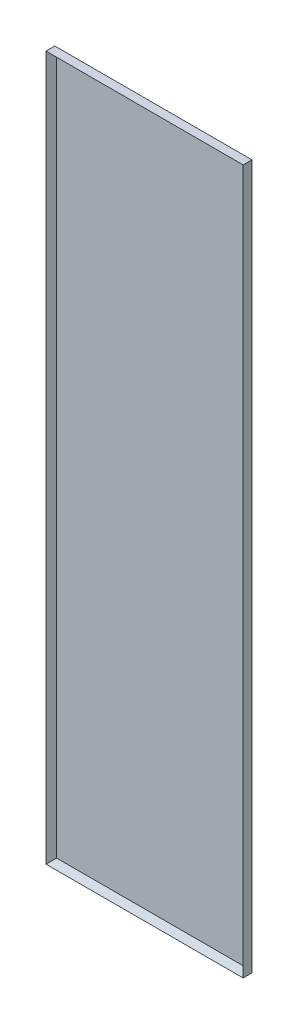
ISO-10303-21;
HEADER;
FILE_DESCRIPTION(('STEP AP214'),'2;1');
FILE_NAME('part.step','',(''),(''),'','','');
FILE_SCHEMA(('AUTOMOTIVE_DESIGN { 1 0 10303 214 1 1 1 1 }'));
ENDSEC;
DATA;
#1=APPLICATION_CONTEXT('core data for automotive mechanical design processes');
#2=APPLICATION_PROTOCOL_DEFINITION('international standard','automotive_design',2000,#1);
#3=PRODUCT_CONTEXT('',#1,'mechanical');
#4=PRODUCT('Part','Part','',(#3));
#5=PRODUCT_RELATED_PRODUCT_CATEGORY('part','',(#4));
#6=PRODUCT_DEFINITION_FORMATION('','',#4);
#7=PRODUCT_DEFINITION_CONTEXT('part definition',#1,'design');
#8=PRODUCT_DEFINITION('design','',#6,#7);
#9=PRODUCT_DEFINITION_SHAPE('','',#8);
#10=(LENGTH_UNIT() NAMED_UNIT(*) SI_UNIT(.MILLI.,.METRE.));
#11=(NAMED_UNIT(*) PLANE_ANGLE_UNIT() SI_UNIT($,.RADIAN.));
#12=(NAMED_UNIT(*) SI_UNIT($,.STERADIAN.) SOLID_ANGLE_UNIT());
#13=UNCERTAINTY_MEASURE_WITH_UNIT(LENGTH_MEASURE(1.E-05),#10,'distance_accuracy_value','');
#14=(GEOMETRIC_REPRESENTATION_CONTEXT(3) GLOBAL_UNCERTAINTY_ASSIGNED_CONTEXT((#13)) GLOBAL_UNIT_ASSIGNED_CONTEXT((#10,
#11,#12)) REPRESENTATION_CONTEXT('',''));
#15=CARTESIAN_POINT('',(0.,0.,0.));
#16=DIRECTION('',(0.,0.,1.));
#17=DIRECTION('',(1.,0.,0.));
#18=AXIS2_PLACEMENT_3D('',#15,#16,#17);
#19=CARTESIAN_POINT('',(0.,0.,25.));
#20=DIRECTION('',(1.,0.,0.));
#21=DIRECTION('',(0.,0.,-1.));
#22=AXIS2_PLACEMENT_3D('',#19,#20,#21);
#23=PLANE('',#22);
#24=DIRECTION('',(0.,-1.,0.));
#25=VECTOR('',#24,1.);
#26=CARTESIAN_POINT('',(0.,0.,0.));
#27=LINE('',#26,#25);
#28=CARTESIAN_POINT('',(0.,2000.,0.));
#29=VERTEX_POINT('',#28);
#30=CARTESIAN_POINT('',(0.,0.,0.));
#31=VERTEX_POINT('',#30);
#32=EDGE_CURVE('E98',#29,#31,#27,.T.);
#33=ORIENTED_EDGE('',*,*,#32,.T.);
#34=DIRECTION('',(0.,0.,-1.));
#35=VECTOR('',#34,1.);
#36=CARTESIAN_POINT('',(0.,0.,25.));
#37=LINE('',#36,#35);
#38=CARTESIAN_POINT('',(0.,0.,25.));
#39=VERTEX_POINT('',#38);
#40=EDGE_CURVE('E11',#39,#31,#37,.T.);
#41=ORIENTED_EDGE('',*,*,#40,.F.);
#42=DIRECTION('',(0.,-1.,0.));
#43=VECTOR('',#42,1.);
#44=CARTESIAN_POINT('',(0.,0.,25.));
#45=LINE('',#44,#43);
#46=CARTESIAN_POINT('',(0.,2000.,25.));
#47=VERTEX_POINT('',#46);
#48=EDGE_CURVE('E99',#47,#39,#45,.T.);
#49=ORIENTED_EDGE('',*,*,#48,.F.);
#50=DIRECTION('',(0.,0.,-1.));
#51=VECTOR('',#50,1.);
#52=CARTESIAN_POINT('',(0.,2000.,25.));
#53=LINE('',#52,#51);
#54=EDGE_CURVE('E93',#47,#29,#53,.T.);
#55=ORIENTED_EDGE('',*,*,#54,.T.);
#56=EDGE_LOOP('',(#33,#41,#49,#55));
#57=FACE_BOUND('',#56,.T.);
#58=ADVANCED_FACE('F43',(#57),#23,.F.);
#59=CARTESIAN_POINT('',(0.,0.,25.));
#60=DIRECTION('',(0.,1.,0.));
#61=DIRECTION('',(0.,0.,1.));
#62=AXIS2_PLACEMENT_3D('',#59,#60,#61);
#63=PLANE('',#62);
#64=DIRECTION('',(1.,0.,0.));
#65=VECTOR('',#64,1.);
#66=CARTESIAN_POINT('',(0.,0.,0.));
#67=LINE('',#66,#65);
#68=CARTESIAN_POINT('',(560.,0.,0.));
#69=VERTEX_POINT('',#68);
#70=EDGE_CURVE('E87',#31,#69,#67,.T.);
#71=ORIENTED_EDGE('',*,*,#70,.T.);
#72=DIRECTION('',(0.,0.,-1.));
#73=VECTOR('',#72,1.);
#74=CARTESIAN_POINT('',(560.,0.,25.));
#75=LINE('',#74,#73);
#76=CARTESIAN_POINT('',(560.,0.,25.));
#77=VERTEX_POINT('',#76);
#78=EDGE_CURVE('E51',#77,#69,#75,.T.);
#79=ORIENTED_EDGE('',*,*,#78,.F.);
#80=DIRECTION('',(1.,0.,0.));
#81=VECTOR('',#80,1.);
#82=CARTESIAN_POINT('',(0.,0.,25.));
#83=LINE('',#82,#81);
#84=EDGE_CURVE('E102',#39,#77,#83,.T.);
#85=ORIENTED_EDGE('',*,*,#84,.F.);
#86=ORIENTED_EDGE('',*,*,#40,.T.);
#87=EDGE_LOOP('',(#71,#79,#85,#86));
#88=FACE_BOUND('',#87,.T.);
#89=ADVANCED_FACE('F116',(#88),#63,.F.);
#90=CARTESIAN_POINT('',(560.,0.,25.));
#91=DIRECTION('',(-1.,0.,0.));
#92=DIRECTION('',(0.,0.,1.));
#93=AXIS2_PLACEMENT_3D('',#90,#91,#92);
#94=PLANE('',#93);
#95=DIRECTION('',(0.,1.,0.));
#96=VECTOR('',#95,1.);
#97=CARTESIAN_POINT('',(560.,0.,0.));
#98=LINE('',#97,#96);
#99=CARTESIAN_POINT('',(560.,2000.,0.));
#100=VERTEX_POINT('',#99);
#101=EDGE_CURVE('E77',#69,#100,#98,.T.);
#102=ORIENTED_EDGE('',*,*,#101,.T.);
#103=DIRECTION('',(0.,0.,-1.));
#104=VECTOR('',#103,1.);
#105=CARTESIAN_POINT('',(560.,2000.,25.));
#106=LINE('',#105,#104);
#107=CARTESIAN_POINT('',(560.,2000.,25.));
#108=VERTEX_POINT('',#107);
#109=EDGE_CURVE('E82',#108,#100,#106,.T.);
#110=ORIENTED_EDGE('',*,*,#109,.F.);
#111=DIRECTION('',(0.,1.,0.));
#112=VECTOR('',#111,1.);
#113=CARTESIAN_POINT('',(560.,0.,25.));
#114=LINE('',#113,#112);
#115=EDGE_CURVE('E108',#77,#108,#114,.T.);
#116=ORIENTED_EDGE('',*,*,#115,.F.);
#117=ORIENTED_EDGE('',*,*,#78,.T.);
#118=EDGE_LOOP('',(#102,#110,#116,#117));
#119=FACE_BOUND('',#118,.T.);
#120=ADVANCED_FACE('F79',(#119),#94,.F.);
#121=CARTESIAN_POINT('',(0.,2000.,25.));
#122=DIRECTION('',(0.,-1.,0.));
#123=DIRECTION('',(1.,0.,0.));
#124=AXIS2_PLACEMENT_3D('',#121,#122,#123);
#125=PLANE('',#124);
#126=DIRECTION('',(-1.,0.,0.));
#127=VECTOR('',#126,1.);
#128=CARTESIAN_POINT('',(0.,2000.,0.));
#129=LINE('',#128,#127);
#130=EDGE_CURVE('E86',#100,#29,#129,.T.);
#131=ORIENTED_EDGE('',*,*,#130,.T.);
#132=ORIENTED_EDGE('',*,*,#54,.F.);
#133=DIRECTION('',(-1.,0.,0.));
#134=VECTOR('',#133,1.);
#135=CARTESIAN_POINT('',(0.,2000.,25.));
#136=LINE('',#135,#134);
#137=EDGE_CURVE('E58',#108,#47,#136,.T.);
#138=ORIENTED_EDGE('',*,*,#137,.F.);
#139=ORIENTED_EDGE('',*,*,#109,.T.);
#140=EDGE_LOOP('',(#131,#132,#138,#139));
#141=FACE_BOUND('',#140,.T.);
#142=ADVANCED_FACE('F90',(#141),#125,.F.);
#143=CARTESIAN_POINT('',(0.,0.,0.));
#144=DIRECTION('',(0.,0.,-1.));
#145=DIRECTION('',(-1.,0.,0.));
#146=AXIS2_PLACEMENT_3D('',#143,#144,#145);
#147=PLANE('',#146);
#148=ORIENTED_EDGE('',*,*,#32,.F.);
#149=ORIENTED_EDGE('',*,*,#130,.F.);
#150=ORIENTED_EDGE('',*,*,#101,.F.);
#151=ORIENTED_EDGE('',*,*,#70,.F.);
#152=EDGE_LOOP('',(#148,#149,#150,#151));
#153=FACE_BOUND('',#152,.T.);
#154=ADVANCED_FACE('F96',(#153),#147,.T.);
#155=CARTESIAN_POINT('',(560.,2000.,25.));
#156=DIRECTION('',(0.,0.707106781186546,-0.707106781186549));
#157=DIRECTION('',(0.,0.707106781186549,0.707106781186546));
#158=AXIS2_PLACEMENT_3D('',#155,#156,#157);
#159=PLANE('',#158);
#160=ORIENTED_EDGE('',*,*,#137,.T.);
#161=DIRECTION('',(-0.577350269189627,0.577350269189626,0.577350269189624));
#162=VECTOR('',#161,1.);
#163=CARTESIAN_POINT('',(186.666666666667,1813.33333333333,-161.666666666666));
#164=LINE('',#163,#162);
#165=CARTESIAN_POINT('',(15.0000000000001,1985.,10.));
#166=VERTEX_POINT('',#165);
#167=EDGE_CURVE('E174',#166,#47,#164,.T.);
#168=ORIENTED_EDGE('',*,*,#167,.F.);
#169=DIRECTION('',(-1.,0.,0.));
#170=VECTOR('',#169,1.);
#171=CARTESIAN_POINT('',(-7.8706882281462E-13,1985.,10.));
#172=LINE('',#171,#170);
#173=CARTESIAN_POINT('',(545.,1985.,10.));
#174=VERTEX_POINT('',#173);
#175=EDGE_CURVE('E159',#174,#166,#172,.T.);
#176=ORIENTED_EDGE('',*,*,#175,.F.);
#177=DIRECTION('',(0.577350269189626,0.577350269189627,0.577350269189624));
#178=VECTOR('',#177,1.);
#179=CARTESIAN_POINT('',(-106.666666666668,1333.33333333333,-641.666666666666));
#180=LINE('',#179,#178);
#181=EDGE_CURVE('E114',#174,#108,#180,.T.);
#182=ORIENTED_EDGE('',*,*,#181,.T.);
#183=EDGE_LOOP('',(#160,#168,#176,#182));
#184=FACE_BOUND('',#183,.T.);
#185=ADVANCED_FACE('F135',(#184),#159,.F.);
#186=CARTESIAN_POINT('',(560.,0.,25.));
#187=DIRECTION('',(0.707106781186546,0.,-0.707106781186549));
#188=DIRECTION('',(-0.707106781186549,0.,-0.707106781186546));
#189=AXIS2_PLACEMENT_3D('',#186,#187,#188);
#190=PLANE('',#189);
#191=ORIENTED_EDGE('',*,*,#115,.T.);
#192=ORIENTED_EDGE('',*,*,#181,.F.);
#193=DIRECTION('',(0.,1.,0.));
#194=VECTOR('',#193,1.);
#195=CARTESIAN_POINT('',(545.,0.,10.));
#196=LINE('',#195,#194);
#197=CARTESIAN_POINT('',(545.,15.0000000000001,10.));
#198=VERTEX_POINT('',#197);
#199=EDGE_CURVE('E165',#198,#174,#196,.T.);
#200=ORIENTED_EDGE('',*,*,#199,.F.);
#201=DIRECTION('',(0.577350269189627,-0.577350269189627,0.577350269189624));
#202=VECTOR('',#201,1.);
#203=CARTESIAN_POINT('',(373.333333333333,186.666666666667,-161.666666666666));
#204=LINE('',#203,#202);
#205=EDGE_CURVE('E171',#198,#77,#204,.T.);
#206=ORIENTED_EDGE('',*,*,#205,.T.);
#207=EDGE_LOOP('',(#191,#192,#200,#206));
#208=FACE_BOUND('',#207,.T.);
#209=ADVANCED_FACE('F136',(#208),#190,.F.);
#210=CARTESIAN_POINT('',(0.,0.,25.));
#211=DIRECTION('',(0.,-0.707106781186546,-0.707106781186549));
#212=DIRECTION('',(0.,0.707106781186549,-0.707106781186546));
#213=AXIS2_PLACEMENT_3D('',#210,#211,#212);
#214=PLANE('',#213);
#215=ORIENTED_EDGE('',*,*,#84,.T.);
#216=ORIENTED_EDGE('',*,*,#205,.F.);
#217=DIRECTION('',(1.,0.,0.));
#218=VECTOR('',#217,1.);
#219=CARTESIAN_POINT('',(0.,15.0000000000001,10.));
#220=LINE('',#219,#218);
#221=CARTESIAN_POINT('',(15.0000000000001,15.0000000000001,10.));
#222=VERTEX_POINT('',#221);
#223=EDGE_CURVE('E167',#222,#198,#220,.T.);
#224=ORIENTED_EDGE('',*,*,#223,.F.);
#225=DIRECTION('',(-0.577350269189627,-0.577350269189627,0.577350269189624));
#226=VECTOR('',#225,1.);
#227=CARTESIAN_POINT('',(666.666666666668,666.666666666669,-641.666666666666));
#228=LINE('',#227,#226);
#229=EDGE_CURVE('E181',#222,#39,#228,.T.);
#230=ORIENTED_EDGE('',*,*,#229,.T.);
#231=EDGE_LOOP('',(#215,#216,#224,#230));
#232=FACE_BOUND('',#231,.T.);
#233=ADVANCED_FACE('F139',(#232),#214,.F.);
#234=CARTESIAN_POINT('',(0.,2000.,25.));
#235=DIRECTION('',(-0.707106781186546,0.,-0.707106781186549));
#236=DIRECTION('',(-0.707106781186549,0.,0.707106781186546));
#237=AXIS2_PLACEMENT_3D('',#234,#235,#236);
#238=PLANE('',#237);
#239=ORIENTED_EDGE('',*,*,#48,.T.);
#240=ORIENTED_EDGE('',*,*,#229,.F.);
#241=DIRECTION('',(0.,-1.,0.));
#242=VECTOR('',#241,1.);
#243=CARTESIAN_POINT('',(15.0000000000001,0.,10.));
#244=LINE('',#243,#242);
#245=EDGE_CURVE('E163',#166,#222,#244,.T.);
#246=ORIENTED_EDGE('',*,*,#245,.F.);
#247=ORIENTED_EDGE('',*,*,#167,.T.);
#248=EDGE_LOOP('',(#239,#240,#246,#247));
#249=FACE_BOUND('',#248,.T.);
#250=ADVANCED_FACE('F143',(#249),#238,.F.);
#251=CARTESIAN_POINT('',(0.,0.,10.));
#252=DIRECTION('',(0.,0.,1.));
#253=DIRECTION('',(1.,0.,0.));
#254=AXIS2_PLACEMENT_3D('',#251,#252,#253);
#255=PLANE('',#254);
#256=ORIENTED_EDGE('',*,*,#175,.T.);
#257=ORIENTED_EDGE('',*,*,#245,.T.);
#258=ORIENTED_EDGE('',*,*,#223,.T.);
#259=ORIENTED_EDGE('',*,*,#199,.T.);
#260=EDGE_LOOP('',(#256,#257,#258,#259));
#261=FACE_BOUND('',#260,.T.);
#262=ADVANCED_FACE('F147',(#261),#255,.T.);
#263=CLOSED_SHELL('',(#58,#89,#120,#142,#154,#185,#209,#233,#250,#262));
#264=MANIFOLD_SOLID_BREP('B2',#263);
#265=ADVANCED_BREP_SHAPE_REPRESENTATION('',(#18,#264),#14);
#266=SHAPE_DEFINITION_REPRESENTATION(#9,#265);
ENDSEC;
END-ISO-10303-21;
